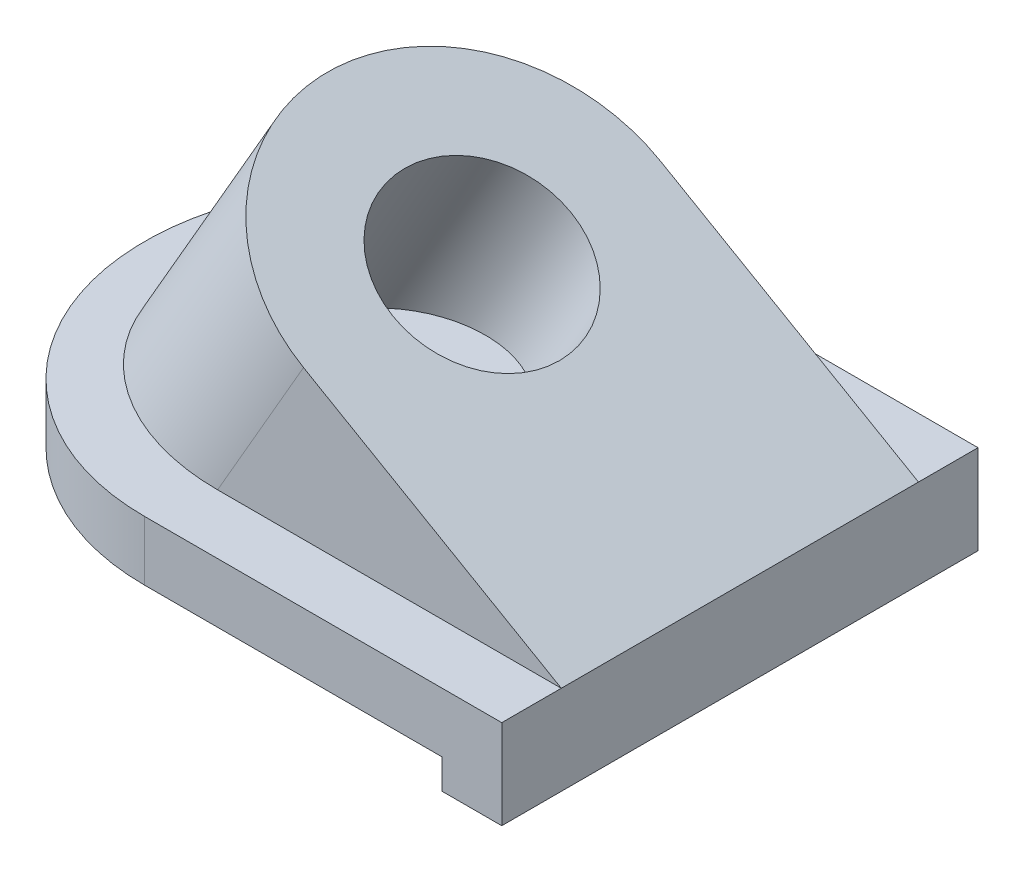
ISO-10303-21;
HEADER;
FILE_DESCRIPTION(('STEP AP214'),'2;1');
FILE_NAME('part.step','',(''),(''),'','','');
FILE_SCHEMA(('AUTOMOTIVE_DESIGN { 1 0 10303 214 1 1 1 1 }'));
ENDSEC;
DATA;
#1=APPLICATION_CONTEXT('core data for automotive mechanical design processes');
#2=APPLICATION_PROTOCOL_DEFINITION('international standard','automotive_design',2000,#1);
#3=PRODUCT_CONTEXT('',#1,'mechanical');
#4=PRODUCT('Part','Part','',(#3));
#5=PRODUCT_RELATED_PRODUCT_CATEGORY('part','',(#4));
#6=PRODUCT_DEFINITION_FORMATION('','',#4);
#7=PRODUCT_DEFINITION_CONTEXT('part definition',#1,'design');
#8=PRODUCT_DEFINITION('design','',#6,#7);
#9=PRODUCT_DEFINITION_SHAPE('','',#8);
#10=(LENGTH_UNIT() NAMED_UNIT(*) SI_UNIT(.MILLI.,.METRE.));
#11=(NAMED_UNIT(*) PLANE_ANGLE_UNIT() SI_UNIT($,.RADIAN.));
#12=(NAMED_UNIT(*) SI_UNIT($,.STERADIAN.) SOLID_ANGLE_UNIT());
#13=UNCERTAINTY_MEASURE_WITH_UNIT(LENGTH_MEASURE(1.E-05),#10,'distance_accuracy_value','');
#14=(GEOMETRIC_REPRESENTATION_CONTEXT(3) GLOBAL_UNCERTAINTY_ASSIGNED_CONTEXT((#13)) GLOBAL_UNIT_ASSIGNED_CONTEXT((#10,
#11,#12)) REPRESENTATION_CONTEXT('',''));
#15=CARTESIAN_POINT('',(0.,0.,0.));
#16=DIRECTION('',(0.,0.,1.));
#17=DIRECTION('',(1.,0.,0.));
#18=AXIS2_PLACEMENT_3D('',#15,#16,#17);
#19=CARTESIAN_POINT('',(0.,12.7,0.));
#20=DIRECTION('',(0.,1.,0.));
#21=DIRECTION('',(0.,0.,1.));
#22=AXIS2_PLACEMENT_3D('',#19,#20,#21);
#23=PLANE('',#22);
#24=DIRECTION('',(1.,0.,0.));
#25=VECTOR('',#24,1.);
#26=CARTESIAN_POINT('',(-58.5271776169267,12.7,38.1));
#27=LINE('',#26,#25);
#28=CARTESIAN_POINT('',(2.87651581291747,12.7,38.1));
#29=VERTEX_POINT('',#28);
#30=CARTESIAN_POINT('',(76.2,12.7,38.1));
#31=VERTEX_POINT('',#30);
#32=EDGE_CURVE('E67',#29,#31,#27,.T.);
#33=ORIENTED_EDGE('',*,*,#32,.F.);
#34=CARTESIAN_POINT('',(2.87651581291747,12.7,0.));
#35=DIRECTION('',(0.,1.,0.));
#36=DIRECTION('',(1.,0.,0.));
#37=AXIS2_PLACEMENT_3D('',#34,#35,#36);
#38=ELLIPSE('',#37,43.9940905122495,38.1);
#39=CARTESIAN_POINT('',(2.87651581291748,12.7,-38.1));
#40=VERTEX_POINT('',#39);
#41=EDGE_CURVE('E224',#29,#40,#38,.F.);
#42=ORIENTED_EDGE('',*,*,#41,.T.);
#43=DIRECTION('',(-1.,0.,0.));
#44=VECTOR('',#43,1.);
#45=CARTESIAN_POINT('',(-58.5271776169267,12.7,-38.1));
#46=LINE('',#45,#44);
#47=CARTESIAN_POINT('',(76.2,12.7,-38.1));
#48=VERTEX_POINT('',#47);
#49=EDGE_CURVE('E73',#48,#40,#46,.T.);
#50=ORIENTED_EDGE('',*,*,#49,.F.);
#51=DIRECTION('',(0.,0.,-1.));
#52=VECTOR('',#51,1.);
#53=CARTESIAN_POINT('',(76.2,12.7,-50.8));
#54=LINE('',#53,#52);
#55=CARTESIAN_POINT('',(76.2,12.7,-50.8));
#56=VERTEX_POINT('',#55);
#57=EDGE_CURVE('E179',#48,#56,#54,.T.);
#58=ORIENTED_EDGE('',*,*,#57,.T.);
#59=DIRECTION('',(-1.,0.,0.));
#60=VECTOR('',#59,1.);
#61=CARTESIAN_POINT('',(0.,12.7,-50.8));
#62=LINE('',#61,#60);
#63=CARTESIAN_POINT('',(0.,12.7,-50.8));
#64=VERTEX_POINT('',#63);
#65=EDGE_CURVE('E182',#56,#64,#62,.T.);
#66=ORIENTED_EDGE('',*,*,#65,.T.);
#67=CARTESIAN_POINT('',(0.,12.7,0.));
#68=DIRECTION('',(0.,1.,0.));
#69=DIRECTION('',(0.,0.,1.));
#70=AXIS2_PLACEMENT_3D('',#67,#68,#69);
#71=CIRCLE('',#70,50.8);
#72=CARTESIAN_POINT('',(0.,12.7,50.8));
#73=VERTEX_POINT('',#72);
#74=EDGE_CURVE('E173',#64,#73,#71,.T.);
#75=ORIENTED_EDGE('',*,*,#74,.T.);
#76=DIRECTION('',(1.,0.,0.));
#77=VECTOR('',#76,1.);
#78=CARTESIAN_POINT('',(76.2,12.7,50.8));
#79=LINE('',#78,#77);
#80=CARTESIAN_POINT('',(76.2,12.7,50.8));
#81=VERTEX_POINT('',#80);
#82=EDGE_CURVE('E176',#73,#81,#79,.T.);
#83=ORIENTED_EDGE('',*,*,#82,.T.);
#84=EDGE_CURVE('E180',#81,#31,#54,.T.);
#85=ORIENTED_EDGE('',*,*,#84,.T.);
#86=EDGE_LOOP('',(#33,#42,#50,#58,#66,#75,#83,#85));
#87=FACE_BOUND('',#86,.T.);
#88=ADVANCED_FACE('F51',(#87),#23,.T.);
#89=CARTESIAN_POINT('',(0.,12.7,0.));
#90=DIRECTION('',(0.,-1.,0.));
#91=DIRECTION('',(0.,0.,-1.));
#92=AXIS2_PLACEMENT_3D('',#89,#90,#91);
#93=CYLINDRICAL_SURFACE('',#92,50.8);
#94=CARTESIAN_POINT('',(0.,0.,0.));
#95=DIRECTION('',(0.,1.,0.));
#96=DIRECTION('',(0.,0.,1.));
#97=AXIS2_PLACEMENT_3D('',#94,#95,#96);
#98=CIRCLE('',#97,50.8);
#99=CARTESIAN_POINT('',(0.,0.,-50.8));
#100=VERTEX_POINT('',#99);
#101=CARTESIAN_POINT('',(0.,0.,50.8));
#102=VERTEX_POINT('',#101);
#103=EDGE_CURVE('E168',#100,#102,#98,.T.);
#104=ORIENTED_EDGE('',*,*,#103,.T.);
#105=DIRECTION('',(0.,-1.,0.));
#106=VECTOR('',#105,1.);
#107=CARTESIAN_POINT('',(0.,12.7,50.8));
#108=LINE('',#107,#106);
#109=EDGE_CURVE('E55',#73,#102,#108,.T.);
#110=ORIENTED_EDGE('',*,*,#109,.F.);
#111=ORIENTED_EDGE('',*,*,#74,.F.);
#112=DIRECTION('',(0.,-1.,0.));
#113=VECTOR('',#112,1.);
#114=CARTESIAN_POINT('',(0.,12.7,-50.8));
#115=LINE('',#114,#113);
#116=EDGE_CURVE('E184',#64,#100,#115,.T.);
#117=ORIENTED_EDGE('',*,*,#116,.T.);
#118=EDGE_LOOP('',(#104,#110,#111,#117));
#119=FACE_BOUND('',#118,.T.);
#120=ADVANCED_FACE('F53',(#119),#93,.T.);
#121=CARTESIAN_POINT('',(76.2,12.7,50.8));
#122=DIRECTION('',(0.,0.,-1.));
#123=DIRECTION('',(-1.,0.,0.));
#124=AXIS2_PLACEMENT_3D('',#121,#122,#123);
#125=PLANE('',#124);
#126=DIRECTION('',(1.,0.,0.));
#127=VECTOR('',#126,1.);
#128=CARTESIAN_POINT('',(76.2,0.,50.8));
#129=LINE('',#128,#127);
#130=CARTESIAN_POINT('',(63.5,0.,50.8));
#131=VERTEX_POINT('',#130);
#132=EDGE_CURVE('E187',#102,#131,#129,.T.);
#133=ORIENTED_EDGE('',*,*,#132,.T.);
#134=DIRECTION('',(0.,-1.,0.));
#135=VECTOR('',#134,1.);
#136=CARTESIAN_POINT('',(63.5,-6.35,50.8));
#137=LINE('',#136,#135);
#138=CARTESIAN_POINT('',(63.5,-6.35,50.8));
#139=VERTEX_POINT('',#138);
#140=EDGE_CURVE('E160',#131,#139,#137,.T.);
#141=ORIENTED_EDGE('',*,*,#140,.T.);
#142=DIRECTION('',(1.,0.,0.));
#143=VECTOR('',#142,1.);
#144=CARTESIAN_POINT('',(76.2,-6.35,50.8));
#145=LINE('',#144,#143);
#146=CARTESIAN_POINT('',(76.2,-6.35,50.8));
#147=VERTEX_POINT('',#146);
#148=EDGE_CURVE('E156',#139,#147,#145,.T.);
#149=ORIENTED_EDGE('',*,*,#148,.T.);
#150=DIRECTION('',(0.,-1.,0.));
#151=VECTOR('',#150,1.);
#152=CARTESIAN_POINT('',(76.2,12.7,50.8));
#153=LINE('',#152,#151);
#154=EDGE_CURVE('E194',#81,#147,#153,.T.);
#155=ORIENTED_EDGE('',*,*,#154,.F.);
#156=ORIENTED_EDGE('',*,*,#82,.F.);
#157=ORIENTED_EDGE('',*,*,#109,.T.);
#158=EDGE_LOOP('',(#133,#141,#149,#155,#156,#157));
#159=FACE_BOUND('',#158,.T.);
#160=ADVANCED_FACE('F202',(#159),#125,.F.);
#161=CARTESIAN_POINT('',(76.2,12.7,-50.8));
#162=DIRECTION('',(-1.,0.,0.));
#163=DIRECTION('',(0.,0.,1.));
#164=AXIS2_PLACEMENT_3D('',#161,#162,#163);
#165=PLANE('',#164);
#166=ORIENTED_EDGE('',*,*,#154,.T.);
#167=DIRECTION('',(0.,0.,1.));
#168=VECTOR('',#167,1.);
#169=CARTESIAN_POINT('',(76.2,-6.35,-50.8));
#170=LINE('',#169,#168);
#171=CARTESIAN_POINT('',(76.2,-6.35,-50.8));
#172=VERTEX_POINT('',#171);
#173=EDGE_CURVE('E165',#172,#147,#170,.T.);
#174=ORIENTED_EDGE('',*,*,#173,.F.);
#175=DIRECTION('',(0.,-1.,0.));
#176=VECTOR('',#175,1.);
#177=CARTESIAN_POINT('',(76.2,12.7,-50.8));
#178=LINE('',#177,#176);
#179=EDGE_CURVE('E193',#56,#172,#178,.T.);
#180=ORIENTED_EDGE('',*,*,#179,.F.);
#181=ORIENTED_EDGE('',*,*,#57,.F.);
#182=DIRECTION('',(0.,0.,-1.));
#183=VECTOR('',#182,1.);
#184=CARTESIAN_POINT('',(76.2,12.7,0.));
#185=LINE('',#184,#183);
#186=EDGE_CURVE('E140',#31,#48,#185,.T.);
#187=ORIENTED_EDGE('',*,*,#186,.F.);
#188=ORIENTED_EDGE('',*,*,#84,.F.);
#189=EDGE_LOOP('',(#166,#174,#180,#181,#187,#188));
#190=FACE_BOUND('',#189,.T.);
#191=ADVANCED_FACE('F221',(#190),#165,.F.);
#192=CARTESIAN_POINT('',(0.,12.7,-50.8));
#193=DIRECTION('',(0.,0.,1.));
#194=DIRECTION('',(1.,0.,0.));
#195=AXIS2_PLACEMENT_3D('',#192,#193,#194);
#196=PLANE('',#195);
#197=ORIENTED_EDGE('',*,*,#179,.T.);
#198=DIRECTION('',(1.,0.,0.));
#199=VECTOR('',#198,1.);
#200=CARTESIAN_POINT('',(76.2,-6.35,-50.8));
#201=LINE('',#200,#199);
#202=CARTESIAN_POINT('',(63.5,-6.35,-50.8));
#203=VERTEX_POINT('',#202);
#204=EDGE_CURVE('E155',#203,#172,#201,.T.);
#205=ORIENTED_EDGE('',*,*,#204,.F.);
#206=DIRECTION('',(0.,-1.,0.));
#207=VECTOR('',#206,1.);
#208=CARTESIAN_POINT('',(63.5,-6.35,-50.8));
#209=LINE('',#208,#207);
#210=CARTESIAN_POINT('',(63.5,0.,-50.8));
#211=VERTEX_POINT('',#210);
#212=EDGE_CURVE('E152',#211,#203,#209,.T.);
#213=ORIENTED_EDGE('',*,*,#212,.F.);
#214=DIRECTION('',(-1.,0.,0.));
#215=VECTOR('',#214,1.);
#216=CARTESIAN_POINT('',(0.,0.,-50.8));
#217=LINE('',#216,#215);
#218=EDGE_CURVE('E177',#211,#100,#217,.T.);
#219=ORIENTED_EDGE('',*,*,#218,.T.);
#220=ORIENTED_EDGE('',*,*,#116,.F.);
#221=ORIENTED_EDGE('',*,*,#65,.F.);
#222=EDGE_LOOP('',(#197,#205,#213,#219,#220,#221));
#223=FACE_BOUND('',#222,.T.);
#224=ADVANCED_FACE('F215',(#223),#196,.F.);
#225=CARTESIAN_POINT('',(0.,0.,0.));
#226=DIRECTION('',(0.,1.,0.));
#227=DIRECTION('',(0.,0.,1.));
#228=AXIS2_PLACEMENT_3D('',#225,#226,#227);
#229=PLANE('',#228);
#230=ORIENTED_EDGE('',*,*,#218,.F.);
#231=DIRECTION('',(0.,0.,1.));
#232=VECTOR('',#231,1.);
#233=CARTESIAN_POINT('',(63.5,0.,-50.8));
#234=LINE('',#233,#232);
#235=EDGE_CURVE('E159',#211,#131,#234,.T.);
#236=ORIENTED_EDGE('',*,*,#235,.T.);
#237=ORIENTED_EDGE('',*,*,#132,.F.);
#238=ORIENTED_EDGE('',*,*,#103,.F.);
#239=EDGE_LOOP('',(#230,#236,#237,#238));
#240=FACE_BOUND('',#239,.T.);
#241=ADVANCED_FACE('F209',(#240),#229,.F.);
#242=CARTESIAN_POINT('',(76.2,-6.35,-50.8));
#243=DIRECTION('',(0.,-1.,0.));
#244=DIRECTION('',(1.,0.,0.));
#245=AXIS2_PLACEMENT_3D('',#242,#243,#244);
#246=PLANE('',#245);
#247=ORIENTED_EDGE('',*,*,#148,.F.);
#248=DIRECTION('',(0.,0.,1.));
#249=VECTOR('',#248,1.);
#250=CARTESIAN_POINT('',(63.5,-6.35,-50.8));
#251=LINE('',#250,#249);
#252=EDGE_CURVE('E169',#203,#139,#251,.T.);
#253=ORIENTED_EDGE('',*,*,#252,.F.);
#254=ORIENTED_EDGE('',*,*,#204,.T.);
#255=ORIENTED_EDGE('',*,*,#173,.T.);
#256=EDGE_LOOP('',(#247,#253,#254,#255));
#257=FACE_BOUND('',#256,.T.);
#258=ADVANCED_FACE('F220',(#257),#246,.T.);
#259=CARTESIAN_POINT('',(63.5,-6.35,-50.8));
#260=DIRECTION('',(-1.,0.,0.));
#261=DIRECTION('',(0.,0.,1.));
#262=AXIS2_PLACEMENT_3D('',#259,#260,#261);
#263=PLANE('',#262);
#264=ORIENTED_EDGE('',*,*,#140,.F.);
#265=ORIENTED_EDGE('',*,*,#235,.F.);
#266=ORIENTED_EDGE('',*,*,#212,.T.);
#267=ORIENTED_EDGE('',*,*,#252,.T.);
#268=EDGE_LOOP('',(#264,#265,#266,#267));
#269=FACE_BOUND('',#268,.T.);
#270=ADVANCED_FACE('F212',(#269),#263,.T.);
#271=CARTESIAN_POINT('',(24.5492613140313,42.5205678841872,0.));
#272=DIRECTION('',(0.500000000000001,0.866025403784438,0.));
#273=DIRECTION('',(-0.866025403784438,0.500000000000001,0.));
#274=AXIS2_PLACEMENT_3D('',#271,#272,#273);
#275=PLANE('',#274);
#276=DIRECTION('',(0.866025403784438,-0.500000000000001,0.));
#277=VECTOR('',#276,1.);
#278=CARTESIAN_POINT('',(24.5492613140313,42.5205678841872,-38.1));
#279=LINE('',#278,#277);
#280=CARTESIAN_POINT('',(21.2073868596882,44.4500000000001,-38.1));
#281=VERTEX_POINT('',#280);
#282=EDGE_CURVE('E126',#281,#48,#279,.T.);
#283=ORIENTED_EDGE('',*,*,#282,.F.);
#284=CARTESIAN_POINT('',(21.2073868596882,44.4500000000001,0.));
#285=DIRECTION('',(0.500000000000001,0.866025403784438,0.));
#286=DIRECTION('',(-0.866025403784438,0.500000000000001,0.));
#287=AXIS2_PLACEMENT_3D('',#284,#285,#286);
#288=CIRCLE('',#287,38.1);
#289=CARTESIAN_POINT('',(21.2073868596882,44.4500000000001,38.1));
#290=VERTEX_POINT('',#289);
#291=EDGE_CURVE('E139',#281,#290,#288,.T.);
#292=ORIENTED_EDGE('',*,*,#291,.T.);
#293=DIRECTION('',(-0.866025403784438,0.500000000000001,0.));
#294=VECTOR('',#293,1.);
#295=CARTESIAN_POINT('',(24.5492613140313,42.5205678841872,38.1));
#296=LINE('',#295,#294);
#297=EDGE_CURVE('E144',#31,#290,#296,.T.);
#298=ORIENTED_EDGE('',*,*,#297,.F.);
#299=ORIENTED_EDGE('',*,*,#186,.T.);
#300=EDGE_LOOP('',(#283,#292,#298,#299));
#301=FACE_BOUND('',#300,.T.);
#302=CARTESIAN_POINT('',(21.2073868596882,44.4500000000001,0.));
#303=DIRECTION('',(0.500000000000001,0.866025403784438,0.));
#304=DIRECTION('',(-0.866025403784438,0.500000000000001,0.));
#305=AXIS2_PLACEMENT_3D('',#302,#303,#304);
#306=CIRCLE('',#305,19.05);
#307=CARTESIAN_POINT('',(4.70960291759464,53.9750000000001,0.));
#308=VERTEX_POINT('',#307);
#309=EDGE_CURVE('E132',#308,#308,#306,.T.);
#310=ORIENTED_EDGE('',*,*,#309,.F.);
#311=EDGE_LOOP('',(#310));
#312=FACE_BOUND('',#311,.T.);
#313=ADVANCED_FACE('F136',(#301,#312),#275,.T.);
#314=CARTESIAN_POINT('',(-61.8690520712698,-99.4426131403118,0.));
#315=DIRECTION('',(0.500000000000001,0.866025403784438,0.));
#316=DIRECTION('',(-0.866025403784438,0.500000000000001,0.));
#317=AXIS2_PLACEMENT_3D('',#314,#315,#316);
#318=CYLINDRICAL_SURFACE('',#317,19.05);
#319=CARTESIAN_POINT('',(2.87651581291747,12.7,0.));
#320=DIRECTION('',(0.,1.,0.));
#321=DIRECTION('',(1.,0.,0.));
#322=AXIS2_PLACEMENT_3D('',#319,#320,#321);
#323=ELLIPSE('',#322,21.9970452561248,19.05);
#324=CARTESIAN_POINT('',(24.8735610690422,12.7,0.));
#325=VERTEX_POINT('',#324);
#326=EDGE_CURVE('E13',#325,#325,#323,.F.);
#327=ORIENTED_EDGE('',*,*,#326,.T.);
#328=EDGE_LOOP('',(#327));
#329=FACE_BOUND('',#328,.T.);
#330=ORIENTED_EDGE('',*,*,#309,.T.);
#331=EDGE_LOOP('',(#330));
#332=FACE_BOUND('',#331,.T.);
#333=ADVANCED_FACE('F236',(#329,#332),#318,.F.);
#334=CARTESIAN_POINT('',(-61.8690520712698,-99.4426131403118,0.));
#335=DIRECTION('',(0.500000000000001,0.866025403784438,0.));
#336=DIRECTION('',(-0.866025403784438,0.500000000000001,0.));
#337=AXIS2_PLACEMENT_3D('',#334,#335,#336);
#338=CYLINDRICAL_SURFACE('',#337,38.1);
#339=ORIENTED_EDGE('',*,*,#41,.F.);
#340=DIRECTION('',(0.500000000000001,0.866025403784438,0.));
#341=VECTOR('',#340,1.);
#342=CARTESIAN_POINT('',(-61.8690520712698,-99.4426131403118,38.1));
#343=LINE('',#342,#341);
#344=EDGE_CURVE('E131',#29,#290,#343,.T.);
#345=ORIENTED_EDGE('',*,*,#344,.T.);
#346=ORIENTED_EDGE('',*,*,#291,.F.);
#347=DIRECTION('',(0.500000000000001,0.866025403784438,0.));
#348=VECTOR('',#347,1.);
#349=CARTESIAN_POINT('',(-61.8690520712698,-99.4426131403118,-38.1));
#350=LINE('',#349,#348);
#351=EDGE_CURVE('E123',#40,#281,#350,.T.);
#352=ORIENTED_EDGE('',*,*,#351,.F.);
#353=EDGE_LOOP('',(#339,#345,#346,#352));
#354=FACE_BOUND('',#353,.T.);
#355=ADVANCED_FACE('F142',(#354),#338,.T.);
#356=CARTESIAN_POINT('',(-58.5271776169267,-101.372045256125,38.1));
#357=DIRECTION('',(0.,0.,-1.));
#358=DIRECTION('',(-1.,0.,0.));
#359=AXIS2_PLACEMENT_3D('',#356,#357,#358);
#360=PLANE('',#359);
#361=ORIENTED_EDGE('',*,*,#344,.F.);
#362=ORIENTED_EDGE('',*,*,#32,.T.);
#363=ORIENTED_EDGE('',*,*,#297,.T.);
#364=EDGE_LOOP('',(#361,#362,#363));
#365=FACE_BOUND('',#364,.T.);
#366=ADVANCED_FACE('F223',(#365),#360,.F.);
#367=CARTESIAN_POINT('',(-58.5271776169267,-101.372045256125,-38.1));
#368=DIRECTION('',(0.,0.,1.));
#369=DIRECTION('',(1.,0.,0.));
#370=AXIS2_PLACEMENT_3D('',#367,#368,#369);
#371=PLANE('',#370);
#372=ORIENTED_EDGE('',*,*,#282,.T.);
#373=ORIENTED_EDGE('',*,*,#49,.T.);
#374=ORIENTED_EDGE('',*,*,#351,.T.);
#375=EDGE_LOOP('',(#372,#373,#374));
#376=FACE_BOUND('',#375,.T.);
#377=ADVANCED_FACE('F125',(#376),#371,.F.);
#378=ORIENTED_EDGE('',*,*,#326,.F.);
#379=EDGE_LOOP('',(#378));
#380=FACE_BOUND('',#379,.T.);
#381=ADVANCED_FACE('F234',(#380),#23,.T.);
#382=CLOSED_SHELL('',(#88,#120,#160,#191,#224,#241,#258,#270,#313,#333,#355,#366,#377,#381));
#383=MANIFOLD_SOLID_BREP('B2',#382);
#384=ADVANCED_BREP_SHAPE_REPRESENTATION('',(#18,#383),#14);
#385=SHAPE_DEFINITION_REPRESENTATION(#9,#384);
ENDSEC;
END-ISO-10303-21;
